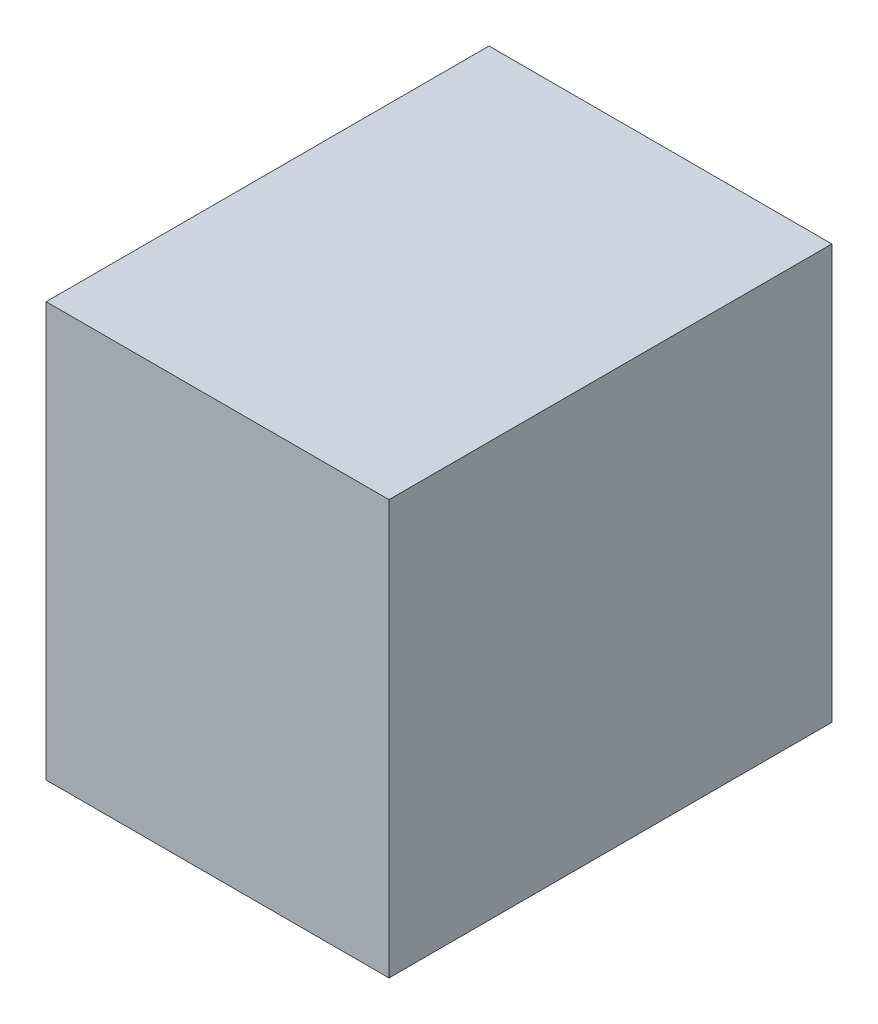
ISO-10303-21;
HEADER;
FILE_DESCRIPTION(('STEP AP214'),'2;1');
FILE_NAME('part.step','',(''),(''),'','','');
FILE_SCHEMA(('AUTOMOTIVE_DESIGN { 1 0 10303 214 1 1 1 1 }'));
ENDSEC;
DATA;
#1=APPLICATION_CONTEXT('core data for automotive mechanical design processes');
#2=APPLICATION_PROTOCOL_DEFINITION('international standard','automotive_design',2000,#1);
#3=PRODUCT_CONTEXT('',#1,'mechanical');
#4=PRODUCT('Part','Part','',(#3));
#5=PRODUCT_RELATED_PRODUCT_CATEGORY('part','',(#4));
#6=PRODUCT_DEFINITION_FORMATION('','',#4);
#7=PRODUCT_DEFINITION_CONTEXT('part definition',#1,'design');
#8=PRODUCT_DEFINITION('design','',#6,#7);
#9=PRODUCT_DEFINITION_SHAPE('','',#8);
#10=(LENGTH_UNIT() NAMED_UNIT(*) SI_UNIT(.MILLI.,.METRE.));
#11=(NAMED_UNIT(*) PLANE_ANGLE_UNIT() SI_UNIT($,.RADIAN.));
#12=(NAMED_UNIT(*) SI_UNIT($,.STERADIAN.) SOLID_ANGLE_UNIT());
#13=UNCERTAINTY_MEASURE_WITH_UNIT(LENGTH_MEASURE(1.E-05),#10,'distance_accuracy_value','');
#14=(GEOMETRIC_REPRESENTATION_CONTEXT(3) GLOBAL_UNCERTAINTY_ASSIGNED_CONTEXT((#13)) GLOBAL_UNIT_ASSIGNED_CONTEXT((#10,
#11,#12)) REPRESENTATION_CONTEXT('',''));
#15=CARTESIAN_POINT('',(0.,0.,0.));
#16=DIRECTION('',(0.,0.,1.));
#17=DIRECTION('',(1.,0.,0.));
#18=AXIS2_PLACEMENT_3D('',#15,#16,#17);
#19=CARTESIAN_POINT('',(-0.5999988,0.72499982,0.));
#20=DIRECTION('',(1.,0.,0.));
#21=DIRECTION('',(0.,-1.,0.));
#22=AXIS2_PLACEMENT_3D('',#19,#20,#21);
#23=PLANE('',#22);
#24=DIRECTION('',(0.,-1.,0.));
#25=VECTOR('',#24,1.);
#26=CARTESIAN_POINT('',(-0.5999988,0.72499982,0.));
#27=LINE('',#26,#25);
#28=CARTESIAN_POINT('',(-0.5999988,0.72499982,0.));
#29=VERTEX_POINT('',#28);
#30=CARTESIAN_POINT('',(-0.5999988,-0.72499982,0.));
#31=VERTEX_POINT('',#30);
#32=EDGE_CURVE('E11',#29,#31,#27,.T.);
#33=ORIENTED_EDGE('',*,*,#32,.T.);
#34=DIRECTION('',(0.,0.,1.));
#35=VECTOR('',#34,1.);
#36=CARTESIAN_POINT('',(-0.5999988,-0.72499982,0.));
#37=LINE('',#36,#35);
#38=CARTESIAN_POINT('',(-0.5999988,-0.72499982,1.54999944));
#39=VERTEX_POINT('',#38);
#40=EDGE_CURVE('E23',#31,#39,#37,.T.);
#41=ORIENTED_EDGE('',*,*,#40,.T.);
#42=DIRECTION('',(0.,-1.,0.));
#43=VECTOR('',#42,1.);
#44=CARTESIAN_POINT('',(-0.5999988,0.72499982,1.54999944));
#45=LINE('',#44,#43);
#46=CARTESIAN_POINT('',(-0.5999988,0.72499982,1.54999944));
#47=VERTEX_POINT('',#46);
#48=EDGE_CURVE('E86',#47,#39,#45,.T.);
#49=ORIENTED_EDGE('',*,*,#48,.F.);
#50=DIRECTION('',(0.,0.,1.));
#51=VECTOR('',#50,1.);
#52=CARTESIAN_POINT('',(-0.5999988,0.72499982,0.));
#53=LINE('',#52,#51);
#54=EDGE_CURVE('E35',#29,#47,#53,.T.);
#55=ORIENTED_EDGE('',*,*,#54,.F.);
#56=EDGE_LOOP('',(#33,#41,#49,#55));
#57=FACE_BOUND('',#56,.T.);
#58=ADVANCED_FACE('F16',(#57),#23,.F.);
#59=CARTESIAN_POINT('',(-0.5999988,-0.72499982,0.));
#60=DIRECTION('',(0.,1.,0.));
#61=DIRECTION('',(1.,0.,0.));
#62=AXIS2_PLACEMENT_3D('',#59,#60,#61);
#63=PLANE('',#62);
#64=DIRECTION('',(1.,0.,0.));
#65=VECTOR('',#64,1.);
#66=CARTESIAN_POINT('',(-0.5999988,-0.72499982,0.));
#67=LINE('',#66,#65);
#68=CARTESIAN_POINT('',(0.60000134,-0.72499982,0.));
#69=VERTEX_POINT('',#68);
#70=EDGE_CURVE('E83',#31,#69,#67,.T.);
#71=ORIENTED_EDGE('',*,*,#70,.T.);
#72=DIRECTION('',(0.,0.,1.));
#73=VECTOR('',#72,1.);
#74=CARTESIAN_POINT('',(0.60000134,-0.72499982,0.));
#75=LINE('',#74,#73);
#76=CARTESIAN_POINT('',(0.60000134,-0.72499982,1.54999944));
#77=VERTEX_POINT('',#76);
#78=EDGE_CURVE('E81',#69,#77,#75,.T.);
#79=ORIENTED_EDGE('',*,*,#78,.T.);
#80=DIRECTION('',(1.,0.,0.));
#81=VECTOR('',#80,1.);
#82=CARTESIAN_POINT('',(-0.5999988,-0.72499982,1.54999944));
#83=LINE('',#82,#81);
#84=EDGE_CURVE('E61',#39,#77,#83,.T.);
#85=ORIENTED_EDGE('',*,*,#84,.F.);
#86=ORIENTED_EDGE('',*,*,#40,.F.);
#87=EDGE_LOOP('',(#71,#79,#85,#86));
#88=FACE_BOUND('',#87,.T.);
#89=ADVANCED_FACE('F88',(#88),#63,.F.);
#90=CARTESIAN_POINT('',(0.60000134,-0.72499982,0.));
#91=DIRECTION('',(-1.,0.,0.));
#92=DIRECTION('',(0.,1.,0.));
#93=AXIS2_PLACEMENT_3D('',#90,#91,#92);
#94=PLANE('',#93);
#95=DIRECTION('',(0.,1.,0.));
#96=VECTOR('',#95,1.);
#97=CARTESIAN_POINT('',(0.60000134,-0.72499982,0.));
#98=LINE('',#97,#96);
#99=CARTESIAN_POINT('',(0.60000134,0.72499982,0.));
#100=VERTEX_POINT('',#99);
#101=EDGE_CURVE('E70',#69,#100,#98,.T.);
#102=ORIENTED_EDGE('',*,*,#101,.T.);
#103=DIRECTION('',(0.,0.,1.));
#104=VECTOR('',#103,1.);
#105=CARTESIAN_POINT('',(0.60000134,0.72499982,0.));
#106=LINE('',#105,#104);
#107=CARTESIAN_POINT('',(0.60000134,0.72499982,1.54999944));
#108=VERTEX_POINT('',#107);
#109=EDGE_CURVE('E64',#100,#108,#106,.T.);
#110=ORIENTED_EDGE('',*,*,#109,.T.);
#111=DIRECTION('',(0.,1.,0.));
#112=VECTOR('',#111,1.);
#113=CARTESIAN_POINT('',(0.60000134,-0.72499982,1.54999944));
#114=LINE('',#113,#112);
#115=EDGE_CURVE('E56',#77,#108,#114,.T.);
#116=ORIENTED_EDGE('',*,*,#115,.F.);
#117=ORIENTED_EDGE('',*,*,#78,.F.);
#118=EDGE_LOOP('',(#102,#110,#116,#117));
#119=FACE_BOUND('',#118,.T.);
#120=ADVANCED_FACE('F68',(#119),#94,.F.);
#121=CARTESIAN_POINT('',(0.60000134,0.72499982,0.));
#122=DIRECTION('',(0.,-1.,0.));
#123=DIRECTION('',(-1.,0.,0.));
#124=AXIS2_PLACEMENT_3D('',#121,#122,#123);
#125=PLANE('',#124);
#126=DIRECTION('',(-1.,0.,0.));
#127=VECTOR('',#126,1.);
#128=CARTESIAN_POINT('',(0.60000134,0.72499982,0.));
#129=LINE('',#128,#127);
#130=EDGE_CURVE('E65',#100,#29,#129,.T.);
#131=ORIENTED_EDGE('',*,*,#130,.T.);
#132=ORIENTED_EDGE('',*,*,#54,.T.);
#133=DIRECTION('',(-1.,0.,0.));
#134=VECTOR('',#133,1.);
#135=CARTESIAN_POINT('',(0.60000134,0.72499982,1.54999944));
#136=LINE('',#135,#134);
#137=EDGE_CURVE('E60',#108,#47,#136,.T.);
#138=ORIENTED_EDGE('',*,*,#137,.F.);
#139=ORIENTED_EDGE('',*,*,#109,.F.);
#140=EDGE_LOOP('',(#131,#132,#138,#139));
#141=FACE_BOUND('',#140,.T.);
#142=ADVANCED_FACE('F75',(#141),#125,.F.);
#143=CARTESIAN_POINT('',(-0.5999988,0.72499982,0.));
#144=DIRECTION('',(0.,0.,-1.));
#145=DIRECTION('',(-1.,0.,0.));
#146=AXIS2_PLACEMENT_3D('',#143,#144,#145);
#147=PLANE('',#146);
#148=ORIENTED_EDGE('',*,*,#130,.F.);
#149=ORIENTED_EDGE('',*,*,#101,.F.);
#150=ORIENTED_EDGE('',*,*,#70,.F.);
#151=ORIENTED_EDGE('',*,*,#32,.F.);
#152=EDGE_LOOP('',(#148,#149,#150,#151));
#153=FACE_BOUND('',#152,.T.);
#154=ADVANCED_FACE('F90',(#153),#147,.T.);
#155=CARTESIAN_POINT('',(-0.5999988,0.72499982,1.54999944));
#156=DIRECTION('',(0.,0.,-1.));
#157=DIRECTION('',(-1.,0.,0.));
#158=AXIS2_PLACEMENT_3D('',#155,#156,#157);
#159=PLANE('',#158);
#160=ORIENTED_EDGE('',*,*,#48,.T.);
#161=ORIENTED_EDGE('',*,*,#84,.T.);
#162=ORIENTED_EDGE('',*,*,#115,.T.);
#163=ORIENTED_EDGE('',*,*,#137,.T.);
#164=EDGE_LOOP('',(#160,#161,#162,#163));
#165=FACE_BOUND('',#164,.T.);
#166=ADVANCED_FACE('F58',(#165),#159,.F.);
#167=CLOSED_SHELL('',(#58,#89,#120,#142,#154,#166));
#168=MANIFOLD_SOLID_BREP('B1',#167);
#169=ADVANCED_BREP_SHAPE_REPRESENTATION('',(#18,#168),#14);
#170=SHAPE_DEFINITION_REPRESENTATION(#9,#169);
ENDSEC;
END-ISO-10303-21;
